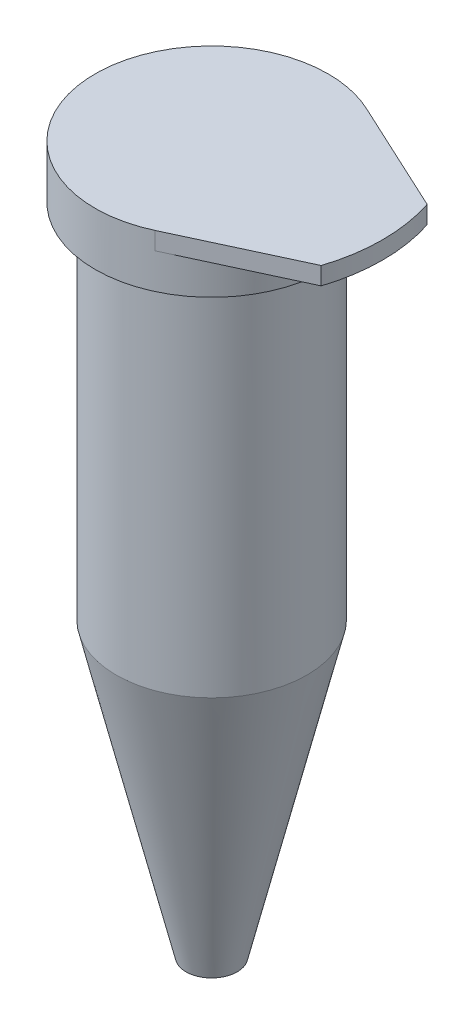
ISO-10303-21;
HEADER;
FILE_DESCRIPTION(('STEP AP214'),'2;1');
FILE_NAME('part.step','',(''),(''),'','','');
FILE_SCHEMA(('AUTOMOTIVE_DESIGN { 1 0 10303 214 1 1 1 1 }'));
ENDSEC;
DATA;
#1=APPLICATION_CONTEXT('core data for automotive mechanical design processes');
#2=APPLICATION_PROTOCOL_DEFINITION('international standard','automotive_design',2000,#1);
#3=PRODUCT_CONTEXT('',#1,'mechanical');
#4=PRODUCT('Part','Part','',(#3));
#5=PRODUCT_RELATED_PRODUCT_CATEGORY('part','',(#4));
#6=PRODUCT_DEFINITION_FORMATION('','',#4);
#7=PRODUCT_DEFINITION_CONTEXT('part definition',#1,'design');
#8=PRODUCT_DEFINITION('design','',#6,#7);
#9=PRODUCT_DEFINITION_SHAPE('','',#8);
#10=(LENGTH_UNIT() NAMED_UNIT(*) SI_UNIT(.MILLI.,.METRE.));
#11=(NAMED_UNIT(*) PLANE_ANGLE_UNIT() SI_UNIT($,.RADIAN.));
#12=(NAMED_UNIT(*) SI_UNIT($,.STERADIAN.) SOLID_ANGLE_UNIT());
#13=UNCERTAINTY_MEASURE_WITH_UNIT(LENGTH_MEASURE(1.E-05),#10,'distance_accuracy_value','');
#14=(GEOMETRIC_REPRESENTATION_CONTEXT(3) GLOBAL_UNCERTAINTY_ASSIGNED_CONTEXT((#13)) GLOBAL_UNIT_ASSIGNED_CONTEXT((#10,
#11,#12)) REPRESENTATION_CONTEXT('',''));
#15=CARTESIAN_POINT('',(0.,0.,0.));
#16=DIRECTION('',(0.,0.,1.));
#17=DIRECTION('',(1.,0.,0.));
#18=AXIS2_PLACEMENT_3D('',#15,#16,#17);
#19=CARTESIAN_POINT('',(0.,0.,0.));
#20=DIRECTION('',(0.,-1.,0.));
#21=DIRECTION('',(0.,0.,-1.));
#22=AXIS2_PLACEMENT_3D('',#19,#20,#21);
#23=CYLINDRICAL_SURFACE('',#22,6.6);
#24=CARTESIAN_POINT('',(0.,37.5,0.));
#25=DIRECTION('',(0.,-1.,0.));
#26=DIRECTION('',(0.,0.,-1.));
#27=AXIS2_PLACEMENT_3D('',#24,#25,#26);
#28=CIRCLE('',#27,6.6);
#29=CARTESIAN_POINT('',(0.,37.5,-6.6));
#30=VERTEX_POINT('',#29);
#31=EDGE_CURVE('E122',#30,#30,#28,.T.);
#32=ORIENTED_EDGE('',*,*,#31,.F.);
#33=EDGE_LOOP('',(#32));
#34=FACE_BOUND('',#33,.T.);
#35=CARTESIAN_POINT('',(0.,39.5,0.));
#36=DIRECTION('',(0.,-1.,0.));
#37=DIRECTION('',(0.,0.,1.));
#38=AXIS2_PLACEMENT_3D('',#35,#36,#37);
#39=CIRCLE('',#38,6.6);
#40=CARTESIAN_POINT('',(2.780130903064,39.5,-5.98588942111601));
#41=VERTEX_POINT('',#40);
#42=CARTESIAN_POINT('',(2.780130903064,39.5,5.98588942111601));
#43=VERTEX_POINT('',#42);
#44=EDGE_CURVE('E60',#41,#43,#39,.T.);
#45=ORIENTED_EDGE('',*,*,#44,.T.);
#46=DIRECTION('',(0.,1.,0.));
#47=VECTOR('',#46,1.);
#48=CARTESIAN_POINT('',(2.780130903064,39.5,5.98588942111601));
#49=LINE('',#48,#47);
#50=CARTESIAN_POINT('',(2.780130903064,40.5,5.98588942111601));
#51=VERTEX_POINT('',#50);
#52=EDGE_CURVE('E118',#43,#51,#49,.T.);
#53=ORIENTED_EDGE('',*,*,#52,.T.);
#54=CARTESIAN_POINT('',(0.,40.5,0.));
#55=DIRECTION('',(0.,-1.,0.));
#56=DIRECTION('',(0.,0.,-1.));
#57=AXIS2_PLACEMENT_3D('',#54,#55,#56);
#58=CIRCLE('',#57,6.6);
#59=CARTESIAN_POINT('',(2.780130903064,40.5,-5.98588942111601));
#60=VERTEX_POINT('',#59);
#61=EDGE_CURVE('E117',#51,#60,#58,.T.);
#62=ORIENTED_EDGE('',*,*,#61,.T.);
#63=DIRECTION('',(0.,1.,0.));
#64=VECTOR('',#63,1.);
#65=CARTESIAN_POINT('',(2.780130903064,39.5,-5.98588942111601));
#66=LINE('',#65,#64);
#67=EDGE_CURVE('E65',#41,#60,#66,.T.);
#68=ORIENTED_EDGE('',*,*,#67,.F.);
#69=EDGE_LOOP('',(#45,#53,#62,#68));
#70=FACE_BOUND('',#69,.T.);
#71=ADVANCED_FACE('F45',(#34,#70),#23,.T.);
#72=CARTESIAN_POINT('',(0.,2.5,0.));
#73=DIRECTION('',(0.,-1.,0.));
#74=DIRECTION('',(-1.,0.,0.));
#75=AXIS2_PLACEMENT_3D('',#72,#73,#74);
#76=SPHERICAL_SURFACE('',#75,2.5);
#77=CARTESIAN_POINT('',(0.,0.464810780055765,0.));
#78=DIRECTION('',(0.,-1.,0.));
#79=DIRECTION('',(0.,0.,-1.));
#80=AXIS2_PLACEMENT_3D('',#77,#78,#79);
#81=CIRCLE('',#80,1.45189697947988);
#82=CARTESIAN_POINT('',(0.,0.464810780055765,1.45189697947988));
#83=VERTEX_POINT('',#82);
#84=EDGE_CURVE('E11',#83,#83,#81,.T.);
#85=ORIENTED_EDGE('',*,*,#84,.T.);
#86=EDGE_LOOP('',(#85));
#87=FACE_BOUND('',#86,.T.);
#88=ADVANCED_FACE('F47',(#87),#76,.T.);
#89=CARTESIAN_POINT('',(0.,0.464810780055765,0.));
#90=DIRECTION('',(0.,1.,0.));
#91=DIRECTION('',(0.,0.,1.));
#92=AXIS2_PLACEMENT_3D('',#89,#90,#91);
#93=CONICAL_SURFACE('',#92,1.45189697947988,0.234381410815255);
#94=CARTESIAN_POINT('',(0.,17.,0.));
#95=DIRECTION('',(0.,-1.,0.));
#96=DIRECTION('',(0.,0.,-1.));
#97=AXIS2_PLACEMENT_3D('',#94,#95,#96);
#98=CIRCLE('',#97,5.4);
#99=CARTESIAN_POINT('',(0.,17.,5.4));
#100=VERTEX_POINT('',#99);
#101=EDGE_CURVE('E53',#100,#100,#98,.T.);
#102=CARTESIAN_POINT('',(0.,17.,5.4));
#103=CARTESIAN_POINT('',(0.,16.8277584456256,5.35887392686958));
#104=CARTESIAN_POINT('',(0.,16.6555168912511,5.31774785373916));
#105=CARTESIAN_POINT('',(0.,16.3110337825023,5.23549570747833));
#106=CARTESIAN_POINT('',(0.,16.1387922281279,5.19436963434791));
#107=CARTESIAN_POINT('',(0.,15.7943091193791,5.11211748808707));
#108=CARTESIAN_POINT('',(0.,15.6220675650046,5.07099141495666));
#109=CARTESIAN_POINT('',(0.,15.2775844562558,4.98873926869582));
#110=CARTESIAN_POINT('',(0.,15.1053429018814,4.9476131955654));
#111=CARTESIAN_POINT('',(0.,14.7608597931325,4.86536104930457));
#112=CARTESIAN_POINT('',(0.,14.5886182387581,4.82423497617415));
#113=CARTESIAN_POINT('',(0.,14.2441351300093,4.74198282991331));
#114=CARTESIAN_POINT('',(0.,14.0718935756349,4.7008567567829));
#115=CARTESIAN_POINT('',(0.,13.727410466886,4.61860461052206));
#116=CARTESIAN_POINT('',(0.,13.5551689125116,4.57747853739164));
#117=CARTESIAN_POINT('',(0.,13.2106858037628,4.49522639113081));
#118=CARTESIAN_POINT('',(0.,13.0384442493884,4.45410031800039));
#119=CARTESIAN_POINT('',(0.,12.6939611406395,4.37184817173955));
#120=CARTESIAN_POINT('',(0.,12.5217195862651,4.33072209860913));
#121=CARTESIAN_POINT('',(0.,12.1772364775163,4.2484699523483));
#122=CARTESIAN_POINT('',(0.,12.0049949231418,4.20734387921788));
#123=CARTESIAN_POINT('',(0.,11.660511814393,4.12509173295704));
#124=CARTESIAN_POINT('',(0.,11.4882702600186,4.08396565982663));
#125=CARTESIAN_POINT('',(0.,11.1437871512697,4.00171351356579));
#126=CARTESIAN_POINT('',(0.,10.9715455968953,3.96058744043537));
#127=CARTESIAN_POINT('',(0.,10.6270624881465,3.87833529417454));
#128=CARTESIAN_POINT('',(0.,10.4548209337721,3.83720922104412));
#129=CARTESIAN_POINT('',(0.,10.1103378250232,3.75495707478328));
#130=CARTESIAN_POINT('',(0.,9.93809627064881,3.71383100165286));
#131=CARTESIAN_POINT('',(0.,9.59361316189997,3.63157885539203));
#132=CARTESIAN_POINT('',(0.,9.42137160752555,3.59045278226161));
#133=CARTESIAN_POINT('',(0.,9.07688849877671,3.50820063600078));
#134=CARTESIAN_POINT('',(0.,8.90464694440229,3.46707456287036));
#135=CARTESIAN_POINT('',(0.,8.56016383565346,3.38482241660952));
#136=CARTESIAN_POINT('',(0.,8.38792228127904,3.3436963434791));
#137=CARTESIAN_POINT('',(0.,8.0434391725302,3.26144419721827));
#138=CARTESIAN_POINT('',(0.,7.87119761815578,3.22031812408785));
#139=CARTESIAN_POINT('',(0.,7.52671450940694,3.13806597782701));
#140=CARTESIAN_POINT('',(0.,7.35447295503252,3.0969399046966));
#141=CARTESIAN_POINT('',(0.,7.00998984628369,3.01468775843576));
#142=CARTESIAN_POINT('',(0.,6.83774829190927,2.97356168530534));
#143=CARTESIAN_POINT('',(0.,6.49326518316043,2.89130953904451));
#144=CARTESIAN_POINT('',(0.,6.32102362878601,2.85018346591409));
#145=CARTESIAN_POINT('',(0.,5.97654052003717,2.76793131965325));
#146=CARTESIAN_POINT('',(0.,5.80429896566275,2.72680524652283));
#147=CARTESIAN_POINT('',(0.,5.45981585691392,2.644553100262));
#148=CARTESIAN_POINT('',(0.,5.2875743025395,2.60342702713158));
#149=CARTESIAN_POINT('',(0.,4.94309119379066,2.52117488087074));
#150=CARTESIAN_POINT('',(0.,4.77084963941624,2.48004880774033));
#151=CARTESIAN_POINT('',(0.,4.4263665306674,2.39779666147949));
#152=CARTESIAN_POINT('',(0.,4.25412497629298,2.35667058834907));
#153=CARTESIAN_POINT('',(0.,3.90964186754414,2.27441844208824));
#154=CARTESIAN_POINT('',(0.,3.73740031316972,2.23329236895782));
#155=CARTESIAN_POINT('',(0.,3.39291720442089,2.15104022269698));
#156=CARTESIAN_POINT('',(0.,3.22067565004647,2.10991414956656));
#157=CARTESIAN_POINT('',(0.,2.87619254129763,2.02766200330573));
#158=CARTESIAN_POINT('',(0.,2.70395098692321,1.98653593017531));
#159=CARTESIAN_POINT('',(0.,2.35946787817437,1.90428378391447));
#160=CARTESIAN_POINT('',(0.,2.18722632379995,1.86315771078406));
#161=CARTESIAN_POINT('',(0.,1.84274321505112,1.78090556452322));
#162=CARTESIAN_POINT('',(0.,1.6705016606767,1.7397794913928));
#163=CARTESIAN_POINT('',(0.,1.32601855192786,1.65752734513197));
#164=CARTESIAN_POINT('',(0.,1.15377699755344,1.61640127200155));
#165=CARTESIAN_POINT('',(0.,0.809293888804603,1.53414912574071));
#166=CARTESIAN_POINT('',(0.,0.637052334430184,1.4930230526103));
#167=CARTESIAN_POINT('',(0.,0.464810780055765,1.45189697947988));
#168=B_SPLINE_CURVE_WITH_KNOTS('',3,(#102,#103,#104,#105,#106,#107,#108,#109,#110,#111,#112,
#113,#114,#115,#116,#117,#118,#119,#120,#121,#122,#123,#124,#125,#126,#127,#128,#129,#130,#131,
#132,#133,#134,#135,#136,#137,#138,#139,#140,#141,#142,#143,#144,#145,#146,#147,#148,#149,#150,
#151,#152,#153,#154,#155,#156,#157,#158,#159,#160,#161,#162,#163,#164,#165,#166,#167),
.UNSPECIFIED.,.F.,.F.,(4,2,2,2,2,2,2,2,2,2,2,2,2,2,2,2,2,2,2,2,2,2,2,2,2,2,2,2,2,2,2,2,4),(0.,
0.53125,1.0625,1.59375,2.125,2.65625,3.1875,3.71875,4.25,4.78125,5.3125,5.84375,6.375,6.90625,
7.4375,7.96875,8.5,9.03125,9.5625,10.09375,10.625,11.15625,11.6875,12.21875,12.75,13.28125,
13.8125,14.34375,14.875,15.40625,15.9375,16.46875,17.),.UNSPECIFIED.);
#169=EDGE_CURVE('BSEAM130',#100,#83,#168,.T.);
#170=ORIENTED_EDGE('',*,*,#101,.T.);
#171=ORIENTED_EDGE('',*,*,#84,.F.);
#172=ORIENTED_EDGE('',*,*,#169,.T.);
#173=ORIENTED_EDGE('',*,*,#169,.F.);
#174=EDGE_LOOP('',(#170,#172,#171,#173));
#175=FACE_BOUND('',#174,.T.);
#176=ADVANCED_FACE('F130',(#175),#93,.T.);
#177=CARTESIAN_POINT('',(0.,0.,0.));
#178=DIRECTION('',(0.,-1.,0.));
#179=DIRECTION('',(0.,0.,-1.));
#180=AXIS2_PLACEMENT_3D('',#177,#178,#179);
#181=CYLINDRICAL_SURFACE('',#180,5.4);
#182=CARTESIAN_POINT('',(0.,37.5,0.));
#183=DIRECTION('',(0.,-1.,0.));
#184=DIRECTION('',(0.,0.,-1.));
#185=AXIS2_PLACEMENT_3D('',#182,#183,#184);
#186=CIRCLE('',#185,5.4);
#187=CARTESIAN_POINT('',(0.,37.5,-5.4));
#188=VERTEX_POINT('',#187);
#189=EDGE_CURVE('E125',#188,#188,#186,.T.);
#190=ORIENTED_EDGE('',*,*,#189,.T.);
#191=EDGE_LOOP('',(#190));
#192=FACE_BOUND('',#191,.T.);
#193=ORIENTED_EDGE('',*,*,#101,.F.);
#194=EDGE_LOOP('',(#193));
#195=FACE_BOUND('',#194,.T.);
#196=ADVANCED_FACE('F133',(#192,#195),#181,.T.);
#197=CARTESIAN_POINT('',(6.6,37.5,0.));
#198=DIRECTION('',(0.,-1.,0.));
#199=DIRECTION('',(0.,0.,-1.));
#200=AXIS2_PLACEMENT_3D('',#197,#198,#199);
#201=PLANE('',#200);
#202=ORIENTED_EDGE('',*,*,#31,.T.);
#203=EDGE_LOOP('',(#202));
#204=FACE_BOUND('',#203,.T.);
#205=ORIENTED_EDGE('',*,*,#189,.F.);
#206=EDGE_LOOP('',(#205));
#207=FACE_BOUND('',#206,.T.);
#208=ADVANCED_FACE('F135',(#204,#207),#201,.T.);
#209=CARTESIAN_POINT('',(0.,40.5,0.));
#210=DIRECTION('',(0.,1.,0.));
#211=DIRECTION('',(0.,0.,1.));
#212=AXIS2_PLACEMENT_3D('',#209,#210,#211);
#213=PLANE('',#212);
#214=ORIENTED_EDGE('',*,*,#61,.F.);
#215=DIRECTION('',(0.906952942593334,0.,-0.421231955009697));
#216=VECTOR('',#215,1.);
#217=CARTESIAN_POINT('',(9.2090382177456,40.5,3.));
#218=LINE('',#217,#216);
#219=CARTESIAN_POINT('',(9.2090382177456,40.5,3.));
#220=VERTEX_POINT('',#219);
#221=EDGE_CURVE('E106',#51,#220,#218,.T.);
#222=ORIENTED_EDGE('',*,*,#221,.T.);
#223=CARTESIAN_POINT('',(0.,40.5,0.));
#224=DIRECTION('',(0.,1.,0.));
#225=DIRECTION('',(0.,0.,1.));
#226=AXIS2_PLACEMENT_3D('',#223,#224,#225);
#227=CIRCLE('',#226,9.68536963135115);
#228=CARTESIAN_POINT('',(9.2090382177456,40.5,-3.));
#229=VERTEX_POINT('',#228);
#230=EDGE_CURVE('E113',#220,#229,#227,.T.);
#231=ORIENTED_EDGE('',*,*,#230,.T.);
#232=DIRECTION('',(-0.906952942593335,0.,-0.421231955009697));
#233=VECTOR('',#232,1.);
#234=CARTESIAN_POINT('',(9.2090382177456,40.5,-3.));
#235=LINE('',#234,#233);
#236=EDGE_CURVE('E90',#229,#60,#235,.T.);
#237=ORIENTED_EDGE('',*,*,#236,.T.);
#238=EDGE_LOOP('',(#214,#222,#231,#237));
#239=FACE_BOUND('',#238,.T.);
#240=ADVANCED_FACE('F142',(#239),#213,.T.);
#241=CARTESIAN_POINT('',(0.,39.5,0.));
#242=DIRECTION('',(0.,1.,0.));
#243=DIRECTION('',(0.,0.,1.));
#244=AXIS2_PLACEMENT_3D('',#241,#242,#243);
#245=CYLINDRICAL_SURFACE('',#244,9.68536963135115);
#246=ORIENTED_EDGE('',*,*,#230,.F.);
#247=DIRECTION('',(0.,1.,0.));
#248=VECTOR('',#247,1.);
#249=CARTESIAN_POINT('',(9.2090382177456,39.5,3.));
#250=LINE('',#249,#248);
#251=CARTESIAN_POINT('',(9.2090382177456,39.5,3.));
#252=VERTEX_POINT('',#251);
#253=EDGE_CURVE('E105',#252,#220,#250,.T.);
#254=ORIENTED_EDGE('',*,*,#253,.F.);
#255=CARTESIAN_POINT('',(0.,39.5,0.));
#256=DIRECTION('',(0.,1.,0.));
#257=DIRECTION('',(0.,0.,1.));
#258=AXIS2_PLACEMENT_3D('',#255,#256,#257);
#259=CIRCLE('',#258,9.68536963135115);
#260=CARTESIAN_POINT('',(9.2090382177456,39.5,-3.));
#261=VERTEX_POINT('',#260);
#262=EDGE_CURVE('E101',#252,#261,#259,.T.);
#263=ORIENTED_EDGE('',*,*,#262,.T.);
#264=DIRECTION('',(0.,1.,0.));
#265=VECTOR('',#264,1.);
#266=CARTESIAN_POINT('',(9.2090382177456,39.5,-3.));
#267=LINE('',#266,#265);
#268=EDGE_CURVE('E85',#261,#229,#267,.T.);
#269=ORIENTED_EDGE('',*,*,#268,.T.);
#270=EDGE_LOOP('',(#246,#254,#263,#269));
#271=FACE_BOUND('',#270,.T.);
#272=ADVANCED_FACE('F104',(#271),#245,.T.);
#273=CARTESIAN_POINT('',(9.2090382177456,39.5,3.));
#274=DIRECTION('',(0.421231955009697,0.,0.906952942593334));
#275=DIRECTION('',(0.906952942593334,0.,-0.421231955009697));
#276=AXIS2_PLACEMENT_3D('',#273,#274,#275);
#277=PLANE('',#276);
#278=ORIENTED_EDGE('',*,*,#221,.F.);
#279=ORIENTED_EDGE('',*,*,#52,.F.);
#280=DIRECTION('',(0.906952942593334,0.,-0.421231955009697));
#281=VECTOR('',#280,1.);
#282=CARTESIAN_POINT('',(9.2090382177456,39.5,3.));
#283=LINE('',#282,#281);
#284=EDGE_CURVE('E95',#43,#252,#283,.T.);
#285=ORIENTED_EDGE('',*,*,#284,.T.);
#286=ORIENTED_EDGE('',*,*,#253,.T.);
#287=EDGE_LOOP('',(#278,#279,#285,#286));
#288=FACE_BOUND('',#287,.T.);
#289=ADVANCED_FACE('F159',(#288),#277,.T.);
#290=CARTESIAN_POINT('',(9.2090382177456,39.5,-3.));
#291=DIRECTION('',(0.421231955009697,0.,-0.906952942593335));
#292=DIRECTION('',(-0.906952942593335,0.,-0.421231955009697));
#293=AXIS2_PLACEMENT_3D('',#290,#291,#292);
#294=PLANE('',#293);
#295=ORIENTED_EDGE('',*,*,#236,.F.);
#296=ORIENTED_EDGE('',*,*,#268,.F.);
#297=DIRECTION('',(-0.906952942593335,0.,-0.421231955009697));
#298=VECTOR('',#297,1.);
#299=CARTESIAN_POINT('',(9.2090382177456,39.5,-3.));
#300=LINE('',#299,#298);
#301=EDGE_CURVE('E88',#261,#41,#300,.T.);
#302=ORIENTED_EDGE('',*,*,#301,.T.);
#303=ORIENTED_EDGE('',*,*,#67,.T.);
#304=EDGE_LOOP('',(#295,#296,#302,#303));
#305=FACE_BOUND('',#304,.T.);
#306=ADVANCED_FACE('F87',(#305),#294,.T.);
#307=CARTESIAN_POINT('',(0.,39.5,0.));
#308=DIRECTION('',(0.,1.,0.));
#309=DIRECTION('',(0.,0.,1.));
#310=AXIS2_PLACEMENT_3D('',#307,#308,#309);
#311=PLANE('',#310);
#312=ORIENTED_EDGE('',*,*,#262,.F.);
#313=ORIENTED_EDGE('',*,*,#284,.F.);
#314=ORIENTED_EDGE('',*,*,#44,.F.);
#315=ORIENTED_EDGE('',*,*,#301,.F.);
#316=EDGE_LOOP('',(#312,#313,#314,#315));
#317=FACE_BOUND('',#316,.T.);
#318=ADVANCED_FACE('F99',(#317),#311,.F.);
#319=CLOSED_SHELL('',(#71,#88,#176,#196,#208,#240,#272,#289,#306,#318));
#320=MANIFOLD_SOLID_BREP('B2',#319);
#321=ADVANCED_BREP_SHAPE_REPRESENTATION('',(#18,#320),#14);
#322=SHAPE_DEFINITION_REPRESENTATION(#9,#321);
ENDSEC;
END-ISO-10303-21;
